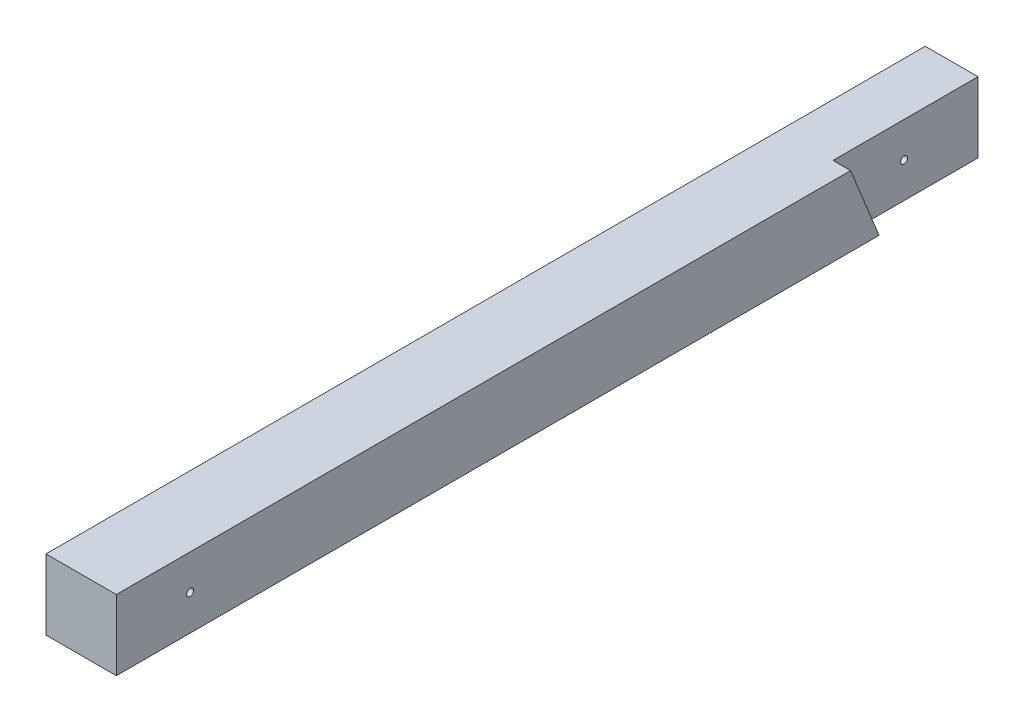
ISO-10303-21;
HEADER;
FILE_DESCRIPTION(('STEP AP214'),'2;1');
FILE_NAME('part.step','',(''),(''),'','','');
FILE_SCHEMA(('AUTOMOTIVE_DESIGN { 1 0 10303 214 1 1 1 1 }'));
ENDSEC;
DATA;
#1=APPLICATION_CONTEXT('core data for automotive mechanical design processes');
#2=APPLICATION_PROTOCOL_DEFINITION('international standard','automotive_design',2000,#1);
#3=PRODUCT_CONTEXT('',#1,'mechanical');
#4=PRODUCT('Part','Part','',(#3));
#5=PRODUCT_RELATED_PRODUCT_CATEGORY('part','',(#4));
#6=PRODUCT_DEFINITION_FORMATION('','',#4);
#7=PRODUCT_DEFINITION_CONTEXT('part definition',#1,'design');
#8=PRODUCT_DEFINITION('design','',#6,#7);
#9=PRODUCT_DEFINITION_SHAPE('','',#8);
#10=(LENGTH_UNIT() NAMED_UNIT(*) SI_UNIT(.MILLI.,.METRE.));
#11=(NAMED_UNIT(*) PLANE_ANGLE_UNIT() SI_UNIT($,.RADIAN.));
#12=(NAMED_UNIT(*) SI_UNIT($,.STERADIAN.) SOLID_ANGLE_UNIT());
#13=UNCERTAINTY_MEASURE_WITH_UNIT(LENGTH_MEASURE(1.E-05),#10,'distance_accuracy_value','');
#14=(GEOMETRIC_REPRESENTATION_CONTEXT(3) GLOBAL_UNCERTAINTY_ASSIGNED_CONTEXT((#13)) GLOBAL_UNIT_ASSIGNED_CONTEXT((#10,
#11,#12)) REPRESENTATION_CONTEXT('',''));
#15=CARTESIAN_POINT('',(0.,0.,0.));
#16=DIRECTION('',(0.,0.,1.));
#17=DIRECTION('',(1.,0.,0.));
#18=AXIS2_PLACEMENT_3D('',#15,#16,#17);
#19=CARTESIAN_POINT('',(50.,50.,625.));
#20=DIRECTION('',(-1.,0.,0.));
#21=DIRECTION('',(0.,-1.,0.));
#22=AXIS2_PLACEMENT_3D('',#19,#20,#21);
#23=PLANE('',#22);
#24=CARTESIAN_POINT('',(50.,0.,520.));
#25=DIRECTION('',(-1.,0.,0.));
#26=DIRECTION('',(0.,-1.,0.));
#27=AXIS2_PLACEMENT_3D('',#24,#25,#26);
#28=CIRCLE('',#27,5.00000000000004);
#29=CARTESIAN_POINT('',(50.,-5.00000000000003,520.));
#30=VERTEX_POINT('',#29);
#31=EDGE_CURVE('E130',#30,#30,#28,.T.);
#32=ORIENTED_EDGE('',*,*,#31,.T.);
#33=EDGE_LOOP('',(#32));
#34=FACE_BOUND('',#33,.T.);
#35=DIRECTION('',(0.,0.,-1.));
#36=VECTOR('',#35,1.);
#37=CARTESIAN_POINT('',(50.,-50.,625.));
#38=LINE('',#37,#36);
#39=CARTESIAN_POINT('',(50.,-50.,625.));
#40=VERTEX_POINT('',#39);
#41=CARTESIAN_POINT('',(50.,-50.0000000000001,-459.315842163909));
#42=VERTEX_POINT('',#41);
#43=EDGE_CURVE('E140',#40,#42,#38,.T.);
#44=ORIENTED_EDGE('',*,*,#43,.T.);
#45=DIRECTION('',(0.,-0.927115658058819,-0.374775341480949));
#46=VECTOR('',#45,1.);
#47=CARTESIAN_POINT('',(50.,49.9999999999999,-418.892046252011));
#48=LINE('',#47,#46);
#49=CARTESIAN_POINT('',(50.,49.9999999999999,-418.892046252011));
#50=VERTEX_POINT('',#49);
#51=EDGE_CURVE('E114',#50,#42,#48,.T.);
#52=ORIENTED_EDGE('',*,*,#51,.F.);
#53=DIRECTION('',(0.,0.,-1.));
#54=VECTOR('',#53,1.);
#55=CARTESIAN_POINT('',(50.,50.,625.));
#56=LINE('',#55,#54);
#57=CARTESIAN_POINT('',(50.,50.,625.));
#58=VERTEX_POINT('',#57);
#59=EDGE_CURVE('E11',#58,#50,#56,.T.);
#60=ORIENTED_EDGE('',*,*,#59,.F.);
#61=DIRECTION('',(0.,1.,0.));
#62=VECTOR('',#61,1.);
#63=CARTESIAN_POINT('',(50.,50.,625.));
#64=LINE('',#63,#62);
#65=EDGE_CURVE('E133',#40,#58,#64,.T.);
#66=ORIENTED_EDGE('',*,*,#65,.F.);
#67=EDGE_LOOP('',(#44,#52,#60,#66));
#68=FACE_BOUND('',#67,.T.);
#69=ADVANCED_FACE('F37',(#34,#68),#23,.F.);
#70=CARTESIAN_POINT('',(-50.,50.,625.));
#71=DIRECTION('',(0.,-1.,0.));
#72=DIRECTION('',(0.,0.,-1.));
#73=AXIS2_PLACEMENT_3D('',#70,#71,#72);
#74=PLANE('',#73);
#75=ORIENTED_EDGE('',*,*,#59,.T.);
#76=DIRECTION('',(1.,0.,0.));
#77=VECTOR('',#76,1.);
#78=CARTESIAN_POINT('',(25.,49.9999999999999,-418.892046252011));
#79=LINE('',#78,#77);
#80=CARTESIAN_POINT('',(25.,49.9999999999999,-418.892046252011));
#81=VERTEX_POINT('',#80);
#82=EDGE_CURVE('E103',#81,#50,#79,.T.);
#83=ORIENTED_EDGE('',*,*,#82,.F.);
#84=DIRECTION('',(0.,0.,1.));
#85=VECTOR('',#84,1.);
#86=CARTESIAN_POINT('',(25.,50.,-625.));
#87=LINE('',#86,#85);
#88=CARTESIAN_POINT('',(25.,50.,-625.));
#89=VERTEX_POINT('',#88);
#90=EDGE_CURVE('E107',#89,#81,#87,.T.);
#91=ORIENTED_EDGE('',*,*,#90,.F.);
#92=DIRECTION('',(-1.,0.,0.));
#93=VECTOR('',#92,1.);
#94=CARTESIAN_POINT('',(-50.,50.,-625.));
#95=LINE('',#94,#93);
#96=CARTESIAN_POINT('',(-50.,50.,-625.));
#97=VERTEX_POINT('',#96);
#98=EDGE_CURVE('E126',#89,#97,#95,.T.);
#99=ORIENTED_EDGE('',*,*,#98,.T.);
#100=DIRECTION('',(0.,0.,-1.));
#101=VECTOR('',#100,1.);
#102=CARTESIAN_POINT('',(-50.,50.,625.));
#103=LINE('',#102,#101);
#104=CARTESIAN_POINT('',(-50.,50.,625.));
#105=VERTEX_POINT('',#104);
#106=EDGE_CURVE('E45',#105,#97,#103,.T.);
#107=ORIENTED_EDGE('',*,*,#106,.F.);
#108=DIRECTION('',(-1.,0.,0.));
#109=VECTOR('',#108,1.);
#110=CARTESIAN_POINT('',(-50.,50.,625.));
#111=LINE('',#110,#109);
#112=EDGE_CURVE('E84',#58,#105,#111,.T.);
#113=ORIENTED_EDGE('',*,*,#112,.F.);
#114=EDGE_LOOP('',(#75,#83,#91,#99,#107,#113));
#115=FACE_BOUND('',#114,.T.);
#116=ADVANCED_FACE('F116',(#115),#74,.F.);
#117=CARTESIAN_POINT('',(-50.,50.,625.));
#118=DIRECTION('',(1.,0.,0.));
#119=DIRECTION('',(0.,1.,0.));
#120=AXIS2_PLACEMENT_3D('',#117,#118,#119);
#121=PLANE('',#120);
#122=CARTESIAN_POINT('',(-50.,0.,-520.));
#123=DIRECTION('',(-1.,0.,0.));
#124=DIRECTION('',(0.,-1.,0.));
#125=AXIS2_PLACEMENT_3D('',#122,#123,#124);
#126=CIRCLE('',#125,5.00000000000004);
#127=CARTESIAN_POINT('',(-50.,-5.00000000000005,-520.));
#128=VERTEX_POINT('',#127);
#129=EDGE_CURVE('E123',#128,#128,#126,.T.);
#130=ORIENTED_EDGE('',*,*,#129,.F.);
#131=EDGE_LOOP('',(#130));
#132=FACE_BOUND('',#131,.T.);
#133=CARTESIAN_POINT('',(-50.,0.,520.));
#134=DIRECTION('',(-1.,0.,0.));
#135=DIRECTION('',(0.,-1.,0.));
#136=AXIS2_PLACEMENT_3D('',#133,#134,#135);
#137=CIRCLE('',#136,5.00000000000004);
#138=CARTESIAN_POINT('',(-50.,-5.00000000000005,520.));
#139=VERTEX_POINT('',#138);
#140=EDGE_CURVE('E127',#139,#139,#137,.T.);
#141=ORIENTED_EDGE('',*,*,#140,.F.);
#142=EDGE_LOOP('',(#141));
#143=FACE_BOUND('',#142,.T.);
#144=DIRECTION('',(0.,-1.,0.));
#145=VECTOR('',#144,1.);
#146=CARTESIAN_POINT('',(-50.,50.,-625.));
#147=LINE('',#146,#145);
#148=CARTESIAN_POINT('',(-50.,-50.,-625.));
#149=VERTEX_POINT('',#148);
#150=EDGE_CURVE('E77',#97,#149,#147,.T.);
#151=ORIENTED_EDGE('',*,*,#150,.T.);
#152=DIRECTION('',(0.,0.,-1.));
#153=VECTOR('',#152,1.);
#154=CARTESIAN_POINT('',(-50.,-50.,625.));
#155=LINE('',#154,#153);
#156=CARTESIAN_POINT('',(-50.,-50.,625.));
#157=VERTEX_POINT('',#156);
#158=EDGE_CURVE('E147',#157,#149,#155,.T.);
#159=ORIENTED_EDGE('',*,*,#158,.F.);
#160=DIRECTION('',(0.,-1.,0.));
#161=VECTOR('',#160,1.);
#162=CARTESIAN_POINT('',(-50.,50.,625.));
#163=LINE('',#162,#161);
#164=EDGE_CURVE('E137',#105,#157,#163,.T.);
#165=ORIENTED_EDGE('',*,*,#164,.F.);
#166=ORIENTED_EDGE('',*,*,#106,.T.);
#167=EDGE_LOOP('',(#151,#159,#165,#166));
#168=FACE_BOUND('',#167,.T.);
#169=ADVANCED_FACE('F150',(#132,#143,#168),#121,.F.);
#170=CARTESIAN_POINT('',(-50.,-50.,625.));
#171=DIRECTION('',(0.,1.,0.));
#172=DIRECTION('',(0.,0.,1.));
#173=AXIS2_PLACEMENT_3D('',#170,#171,#172);
#174=PLANE('',#173);
#175=DIRECTION('',(0.,0.,-1.));
#176=VECTOR('',#175,1.);
#177=CARTESIAN_POINT('',(25.,-50.0000000000001,-459.315842163909));
#178=LINE('',#177,#176);
#179=CARTESIAN_POINT('',(25.,-50.0000000000001,-459.315842163909));
#180=VERTEX_POINT('',#179);
#181=CARTESIAN_POINT('',(25.,-50.,-625.));
#182=VERTEX_POINT('',#181);
#183=EDGE_CURVE('E52',#180,#182,#178,.T.);
#184=ORIENTED_EDGE('',*,*,#183,.F.);
#185=DIRECTION('',(1.,0.,0.));
#186=VECTOR('',#185,1.);
#187=CARTESIAN_POINT('',(25.,-50.0000000000001,-459.315842163909));
#188=LINE('',#187,#186);
#189=EDGE_CURVE('E106',#180,#42,#188,.T.);
#190=ORIENTED_EDGE('',*,*,#189,.T.);
#191=ORIENTED_EDGE('',*,*,#43,.F.);
#192=DIRECTION('',(1.,0.,0.));
#193=VECTOR('',#192,1.);
#194=CARTESIAN_POINT('',(-50.,-50.,625.));
#195=LINE('',#194,#193);
#196=EDGE_CURVE('E61',#157,#40,#195,.T.);
#197=ORIENTED_EDGE('',*,*,#196,.F.);
#198=ORIENTED_EDGE('',*,*,#158,.T.);
#199=DIRECTION('',(1.,0.,0.));
#200=VECTOR('',#199,1.);
#201=CARTESIAN_POINT('',(-50.,-50.,-625.));
#202=LINE('',#201,#200);
#203=EDGE_CURVE('E135',#149,#182,#202,.T.);
#204=ORIENTED_EDGE('',*,*,#203,.T.);
#205=EDGE_LOOP('',(#184,#190,#191,#197,#198,#204));
#206=FACE_BOUND('',#205,.T.);
#207=ADVANCED_FACE('F155',(#206),#174,.F.);
#208=CARTESIAN_POINT('',(0.,0.,625.));
#209=DIRECTION('',(0.,0.,1.));
#210=DIRECTION('',(1.,0.,0.));
#211=AXIS2_PLACEMENT_3D('',#208,#209,#210);
#212=PLANE('',#211);
#213=ORIENTED_EDGE('',*,*,#65,.T.);
#214=ORIENTED_EDGE('',*,*,#112,.T.);
#215=ORIENTED_EDGE('',*,*,#164,.T.);
#216=ORIENTED_EDGE('',*,*,#196,.T.);
#217=EDGE_LOOP('',(#213,#214,#215,#216));
#218=FACE_BOUND('',#217,.T.);
#219=ADVANCED_FACE('F158',(#218),#212,.T.);
#220=CARTESIAN_POINT('',(0.,0.,-625.));
#221=DIRECTION('',(0.,0.,1.));
#222=DIRECTION('',(1.,0.,0.));
#223=AXIS2_PLACEMENT_3D('',#220,#221,#222);
#224=PLANE('',#223);
#225=ORIENTED_EDGE('',*,*,#98,.F.);
#226=DIRECTION('',(0.,1.,0.));
#227=VECTOR('',#226,1.);
#228=CARTESIAN_POINT('',(25.,-50.,-625.));
#229=LINE('',#228,#227);
#230=EDGE_CURVE('E112',#182,#89,#229,.T.);
#231=ORIENTED_EDGE('',*,*,#230,.F.);
#232=ORIENTED_EDGE('',*,*,#203,.F.);
#233=ORIENTED_EDGE('',*,*,#150,.F.);
#234=EDGE_LOOP('',(#225,#231,#232,#233));
#235=FACE_BOUND('',#234,.T.);
#236=ADVANCED_FACE('F153',(#235),#224,.F.);
#237=CARTESIAN_POINT('',(50.,0.,520.));
#238=DIRECTION('',(-1.,0.,0.));
#239=DIRECTION('',(0.,-1.,0.));
#240=AXIS2_PLACEMENT_3D('',#237,#238,#239);
#241=CYLINDRICAL_SURFACE('',#240,5.00000000000004);
#242=ORIENTED_EDGE('',*,*,#31,.F.);
#243=EDGE_LOOP('',(#242));
#244=FACE_BOUND('',#243,.T.);
#245=ORIENTED_EDGE('',*,*,#140,.T.);
#246=EDGE_LOOP('',(#245));
#247=FACE_BOUND('',#246,.T.);
#248=ADVANCED_FACE('F166',(#244,#247),#241,.F.);
#249=CARTESIAN_POINT('',(50.,0.,-520.));
#250=DIRECTION('',(-1.,0.,0.));
#251=DIRECTION('',(0.,-1.,0.));
#252=AXIS2_PLACEMENT_3D('',#249,#250,#251);
#253=CYLINDRICAL_SURFACE('',#252,5.00000000000004);
#254=CARTESIAN_POINT('',(25.,0.,-520.));
#255=DIRECTION('',(-1.,0.,0.));
#256=DIRECTION('',(0.,-1.,0.));
#257=AXIS2_PLACEMENT_3D('',#254,#255,#256);
#258=CIRCLE('',#257,5.00000000000004);
#259=CARTESIAN_POINT('',(25.,-5.00000000000004,-520.));
#260=VERTEX_POINT('',#259);
#261=EDGE_CURVE('E40',#260,#260,#258,.F.);
#262=ORIENTED_EDGE('',*,*,#261,.T.);
#263=EDGE_LOOP('',(#262));
#264=FACE_BOUND('',#263,.T.);
#265=ORIENTED_EDGE('',*,*,#129,.T.);
#266=EDGE_LOOP('',(#265));
#267=FACE_BOUND('',#266,.T.);
#268=ADVANCED_FACE('F181',(#264,#267),#253,.F.);
#269=CARTESIAN_POINT('',(25.,0.,0.));
#270=DIRECTION('',(-1.,0.,0.));
#271=DIRECTION('',(0.,-1.,0.));
#272=AXIS2_PLACEMENT_3D('',#269,#270,#271);
#273=PLANE('',#272);
#274=ORIENTED_EDGE('',*,*,#90,.T.);
#275=DIRECTION('',(0.,-0.927115658058819,-0.374775341480949));
#276=VECTOR('',#275,1.);
#277=CARTESIAN_POINT('',(25.,49.9999999999999,-418.892046252011));
#278=LINE('',#277,#276);
#279=EDGE_CURVE('E99',#81,#180,#278,.T.);
#280=ORIENTED_EDGE('',*,*,#279,.T.);
#281=ORIENTED_EDGE('',*,*,#183,.T.);
#282=ORIENTED_EDGE('',*,*,#230,.T.);
#283=EDGE_LOOP('',(#274,#280,#281,#282));
#284=FACE_BOUND('',#283,.T.);
#285=ORIENTED_EDGE('',*,*,#261,.F.);
#286=EDGE_LOOP('',(#285));
#287=FACE_BOUND('',#286,.T.);
#288=ADVANCED_FACE('F110',(#284,#287),#273,.F.);
#289=CARTESIAN_POINT('',(25.,49.9999999999999,-418.892046252011));
#290=DIRECTION('',(0.,-0.374775341480949,0.92711565805882));
#291=DIRECTION('',(0.,-0.92711565805882,-0.374775341480949));
#292=AXIS2_PLACEMENT_3D('',#289,#290,#291);
#293=PLANE('',#292);
#294=ORIENTED_EDGE('',*,*,#51,.T.);
#295=ORIENTED_EDGE('',*,*,#189,.F.);
#296=ORIENTED_EDGE('',*,*,#279,.F.);
#297=ORIENTED_EDGE('',*,*,#82,.T.);
#298=EDGE_LOOP('',(#294,#295,#296,#297));
#299=FACE_BOUND('',#298,.T.);
#300=ADVANCED_FACE('F101',(#299),#293,.F.);
#301=CLOSED_SHELL('',(#69,#116,#169,#207,#219,#236,#248,#268,#288,#300));
#302=MANIFOLD_SOLID_BREP('B2',#301);
#303=ADVANCED_BREP_SHAPE_REPRESENTATION('',(#18,#302),#14);
#304=SHAPE_DEFINITION_REPRESENTATION(#9,#303);
ENDSEC;
END-ISO-10303-21;
